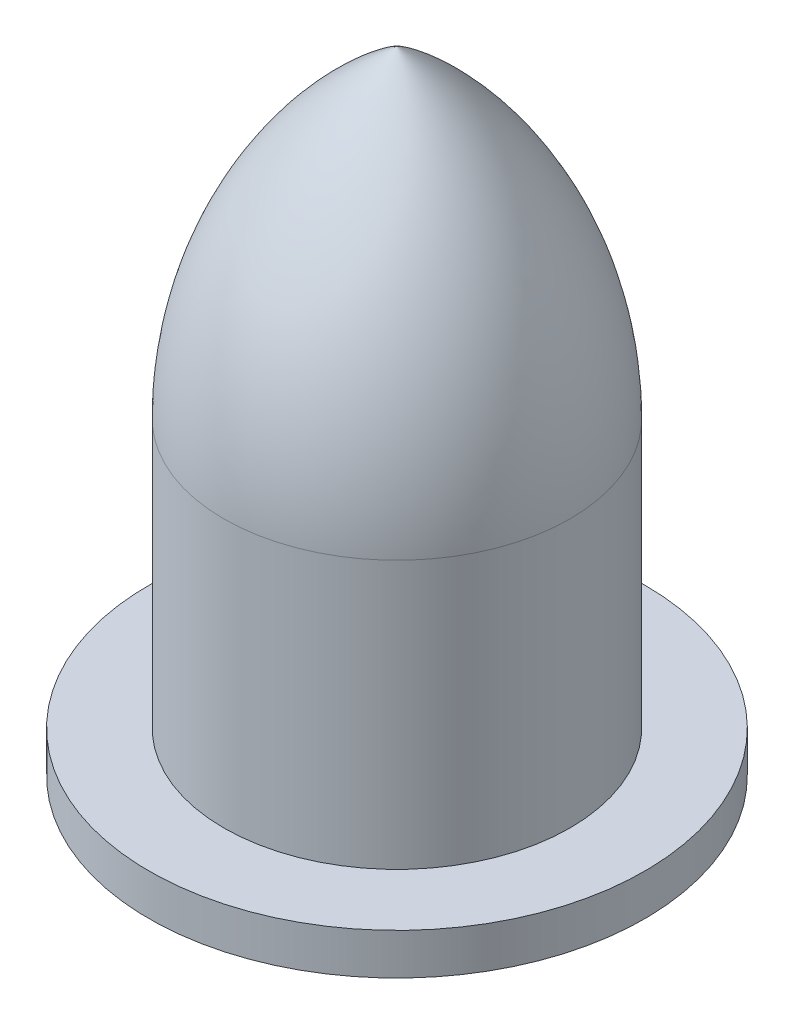
ISO-10303-21;
HEADER;
FILE_DESCRIPTION(('STEP AP214'),'2;1');
FILE_NAME('part.step','',(''),(''),'','','');
FILE_SCHEMA(('AUTOMOTIVE_DESIGN { 1 0 10303 214 1 1 1 1 }'));
ENDSEC;
DATA;
#1=APPLICATION_CONTEXT('core data for automotive mechanical design processes');
#2=APPLICATION_PROTOCOL_DEFINITION('international standard','automotive_design',2000,#1);
#3=PRODUCT_CONTEXT('',#1,'mechanical');
#4=PRODUCT('Part','Part','',(#3));
#5=PRODUCT_RELATED_PRODUCT_CATEGORY('part','',(#4));
#6=PRODUCT_DEFINITION_FORMATION('','',#4);
#7=PRODUCT_DEFINITION_CONTEXT('part definition',#1,'design');
#8=PRODUCT_DEFINITION('design','',#6,#7);
#9=PRODUCT_DEFINITION_SHAPE('','',#8);
#10=(LENGTH_UNIT() NAMED_UNIT(*) SI_UNIT(.MILLI.,.METRE.));
#11=(NAMED_UNIT(*) PLANE_ANGLE_UNIT() SI_UNIT($,.RADIAN.));
#12=(NAMED_UNIT(*) SI_UNIT($,.STERADIAN.) SOLID_ANGLE_UNIT());
#13=UNCERTAINTY_MEASURE_WITH_UNIT(LENGTH_MEASURE(1.E-05),#10,'distance_accuracy_value','');
#14=(GEOMETRIC_REPRESENTATION_CONTEXT(3) GLOBAL_UNCERTAINTY_ASSIGNED_CONTEXT((#13)) GLOBAL_UNIT_ASSIGNED_CONTEXT((#10,
#11,#12)) REPRESENTATION_CONTEXT('',''));
#15=CARTESIAN_POINT('',(0.,0.,0.));
#16=DIRECTION('',(0.,0.,1.));
#17=DIRECTION('',(1.,0.,0.));
#18=AXIS2_PLACEMENT_3D('',#15,#16,#17);
#19=CARTESIAN_POINT('',(6.,14.8949408410269,0.));
#20=DIRECTION('',(0.,-1.,0.));
#21=DIRECTION('',(0.,0.,-1.));
#22=AXIS2_PLACEMENT_3D('',#19,#20,#21);
#23=PLANE('',#22);
#24=CARTESIAN_POINT('',(0.,14.8949408410269,0.));
#25=DIRECTION('',(0.,-1.,0.));
#26=DIRECTION('',(0.,0.,-1.));
#27=AXIS2_PLACEMENT_3D('',#24,#25,#26);
#28=CIRCLE('',#27,6.);
#29=CARTESIAN_POINT('',(0.,14.8949408410269,-6.));
#30=VERTEX_POINT('',#29);
#31=EDGE_CURVE('E11',#30,#30,#28,.T.);
#32=ORIENTED_EDGE('',*,*,#31,.T.);
#33=EDGE_LOOP('',(#32));
#34=FACE_BOUND('',#33,.T.);
#35=CARTESIAN_POINT('',(0.,14.8949408410269,0.));
#36=DIRECTION('',(0.,-1.,0.));
#37=DIRECTION('',(0.,0.,-1.));
#38=AXIS2_PLACEMENT_3D('',#35,#36,#37);
#39=CIRCLE('',#38,2.5);
#40=CARTESIAN_POINT('',(0.,14.8949408410269,-2.5));
#41=VERTEX_POINT('',#40);
#42=EDGE_CURVE('E73',#41,#41,#39,.T.);
#43=ORIENTED_EDGE('',*,*,#42,.F.);
#44=EDGE_LOOP('',(#43));
#45=FACE_BOUND('',#44,.T.);
#46=ADVANCED_FACE('F38',(#34,#45),#23,.T.);
#47=CARTESIAN_POINT('',(0.,0.,0.));
#48=DIRECTION('',(0.,-1.,0.));
#49=DIRECTION('',(0.,0.,-1.));
#50=AXIS2_PLACEMENT_3D('',#47,#48,#49);
#51=CYLINDRICAL_SURFACE('',#50,6.);
#52=CARTESIAN_POINT('',(0.,15.8949408410269,0.));
#53=DIRECTION('',(0.,-1.,0.));
#54=DIRECTION('',(0.,0.,-1.));
#55=AXIS2_PLACEMENT_3D('',#52,#53,#54);
#56=CIRCLE('',#55,6.);
#57=CARTESIAN_POINT('',(0.,15.8949408410269,-6.));
#58=VERTEX_POINT('',#57);
#59=EDGE_CURVE('E46',#58,#58,#56,.T.);
#60=ORIENTED_EDGE('',*,*,#59,.T.);
#61=EDGE_LOOP('',(#60));
#62=FACE_BOUND('',#61,.T.);
#63=ORIENTED_EDGE('',*,*,#31,.F.);
#64=EDGE_LOOP('',(#63));
#65=FACE_BOUND('',#64,.T.);
#66=ADVANCED_FACE('F81',(#62,#65),#51,.T.);
#67=CARTESIAN_POINT('',(6.,15.8949408410269,0.));
#68=DIRECTION('',(0.,1.,0.));
#69=DIRECTION('',(0.,0.,1.));
#70=AXIS2_PLACEMENT_3D('',#67,#68,#69);
#71=PLANE('',#70);
#72=CARTESIAN_POINT('',(0.,15.8949408410269,0.));
#73=DIRECTION('',(0.,-1.,0.));
#74=DIRECTION('',(0.,0.,-1.));
#75=AXIS2_PLACEMENT_3D('',#72,#73,#74);
#76=CIRCLE('',#75,4.19124768918228);
#77=CARTESIAN_POINT('',(0.,15.8949408410269,-4.19124768918228));
#78=VERTEX_POINT('',#77);
#79=EDGE_CURVE('E65',#78,#78,#76,.T.);
#80=ORIENTED_EDGE('',*,*,#79,.T.);
#81=EDGE_LOOP('',(#80));
#82=FACE_BOUND('',#81,.T.);
#83=ORIENTED_EDGE('',*,*,#59,.F.);
#84=EDGE_LOOP('',(#83));
#85=FACE_BOUND('',#84,.T.);
#86=ADVANCED_FACE('F84',(#82,#85),#71,.T.);
#87=CARTESIAN_POINT('',(0.,0.,0.));
#88=DIRECTION('',(0.,-1.,0.));
#89=DIRECTION('',(0.,0.,-1.));
#90=AXIS2_PLACEMENT_3D('',#87,#88,#89);
#91=CYLINDRICAL_SURFACE('',#90,4.19124768918228);
#92=CARTESIAN_POINT('',(0.,22.3776320212985,0.));
#93=DIRECTION('',(0.,-1.,0.));
#94=DIRECTION('',(0.,0.,-1.));
#95=AXIS2_PLACEMENT_3D('',#92,#93,#94);
#96=CIRCLE('',#95,4.19124768918228);
#97=CARTESIAN_POINT('',(0.,22.3776320212985,-4.19124768918228));
#98=VERTEX_POINT('',#97);
#99=EDGE_CURVE('E62',#98,#98,#96,.T.);
#100=ORIENTED_EDGE('',*,*,#99,.T.);
#101=EDGE_LOOP('',(#100));
#102=FACE_BOUND('',#101,.T.);
#103=ORIENTED_EDGE('',*,*,#79,.F.);
#104=EDGE_LOOP('',(#103));
#105=FACE_BOUND('',#104,.T.);
#106=ADVANCED_FACE('F58',(#102,#105),#91,.T.);
#107=CARTESIAN_POINT('',(0.,22.3776320212985,5.19460590498096));
#108=DIRECTION('',(-1.,0.,0.));
#109=DIRECTION('',(0.,0.,-1.));
#110=AXIS2_PLACEMENT_3D('',#107,#108,#109);
#111=CIRCLE('',#110,9.38585359416323);
#112=TRIMMED_CURVE('',#111,(PARAMETER_VALUE(-0.984294851429032)),
(PARAMETER_VALUE(0.984294851429032)),.T.,.PARAMETER.);
#113=CARTESIAN_POINT('',(0.,22.3776320212985,0.));
#114=DIRECTION('',(0.,-1.,0.));
#115=AXIS1_PLACEMENT('',#113,#114);
#116=SURFACE_OF_REVOLUTION('',#112,#115);
#117=CARTESIAN_POINT('',(0.,30.1949408410269,0.));
#118=VERTEX_POINT('',#117);
#119=VERTEX_LOOP('',#118);
#120=FACE_BOUND('',#119,.T.);
#121=ORIENTED_EDGE('',*,*,#99,.F.);
#122=EDGE_LOOP('',(#121));
#123=FACE_BOUND('',#122,.T.);
#124=ADVANCED_FACE('F54',(#120,#123),#116,.T.);
#125=CARTESIAN_POINT('',(0.,23.9732064964542,0.));
#126=DIRECTION('',(0.,-1.,0.));
#127=DIRECTION('',(0.,0.,-1.));
#128=AXIS2_PLACEMENT_3D('',#125,#126,#127);
#129=CONICAL_SURFACE('',#128,0.,0.944548188324282);
#130=CARTESIAN_POINT('',(0.,22.1647465045298,0.));
#131=DIRECTION('',(0.,-1.,0.));
#132=DIRECTION('',(0.,0.,-1.));
#133=AXIS2_PLACEMENT_3D('',#130,#131,#132);
#134=CIRCLE('',#133,2.5);
#135=CARTESIAN_POINT('',(0.,22.1647465045298,-2.5));
#136=VERTEX_POINT('',#135);
#137=EDGE_CURVE('E66',#136,#136,#134,.T.);
#138=ORIENTED_EDGE('',*,*,#137,.T.);
#139=EDGE_LOOP('',(#138));
#140=FACE_BOUND('',#139,.T.);
#141=CARTESIAN_POINT('',(0.,23.9732064964542,0.));
#142=VERTEX_POINT('',#141);
#143=VERTEX_LOOP('',#142);
#144=FACE_BOUND('',#143,.T.);
#145=ADVANCED_FACE('F57',(#140,#144),#129,.F.);
#146=CARTESIAN_POINT('',(0.,0.,0.));
#147=DIRECTION('',(0.,-1.,0.));
#148=DIRECTION('',(0.,0.,-1.));
#149=AXIS2_PLACEMENT_3D('',#146,#147,#148);
#150=CYLINDRICAL_SURFACE('',#149,2.5);
#151=ORIENTED_EDGE('',*,*,#42,.T.);
#152=EDGE_LOOP('',(#151));
#153=FACE_BOUND('',#152,.T.);
#154=ORIENTED_EDGE('',*,*,#137,.F.);
#155=EDGE_LOOP('',(#154));
#156=FACE_BOUND('',#155,.T.);
#157=ADVANCED_FACE('F102',(#153,#156),#150,.F.);
#158=CLOSED_SHELL('',(#46,#66,#86,#106,#124,#145,#157));
#159=MANIFOLD_SOLID_BREP('B2',#158);
#160=ADVANCED_BREP_SHAPE_REPRESENTATION('',(#18,#159),#14);
#161=SHAPE_DEFINITION_REPRESENTATION(#9,#160);
ENDSEC;
END-ISO-10303-21;
